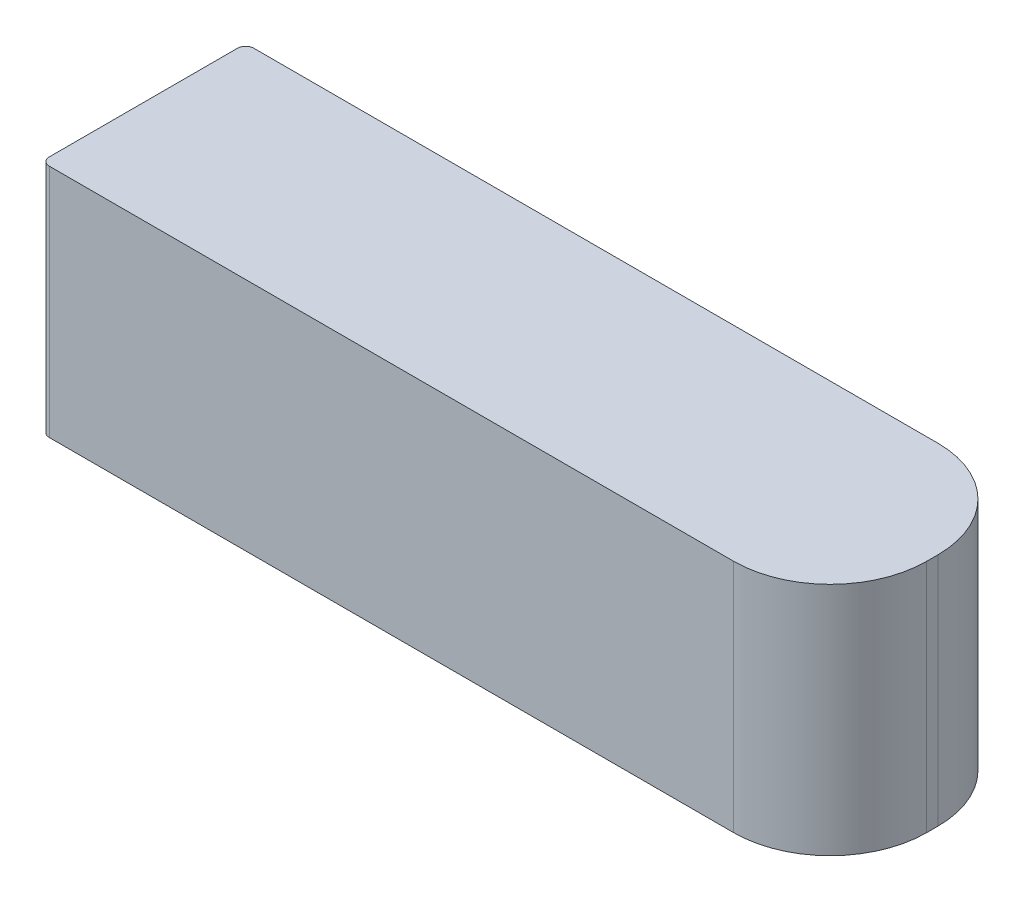
ISO-10303-21;
HEADER;
FILE_DESCRIPTION(('STEP AP214'),'2;1');
FILE_NAME('part.step','',(''),(''),'','','');
FILE_SCHEMA(('AUTOMOTIVE_DESIGN { 1 0 10303 214 1 1 1 1 }'));
ENDSEC;
DATA;
#1=APPLICATION_CONTEXT('core data for automotive mechanical design processes');
#2=APPLICATION_PROTOCOL_DEFINITION('international standard','automotive_design',2000,#1);
#3=PRODUCT_CONTEXT('',#1,'mechanical');
#4=PRODUCT('Part','Part','',(#3));
#5=PRODUCT_RELATED_PRODUCT_CATEGORY('part','',(#4));
#6=PRODUCT_DEFINITION_FORMATION('','',#4);
#7=PRODUCT_DEFINITION_CONTEXT('part definition',#1,'design');
#8=PRODUCT_DEFINITION('design','',#6,#7);
#9=PRODUCT_DEFINITION_SHAPE('','',#8);
#10=(LENGTH_UNIT() NAMED_UNIT(*) SI_UNIT(.MILLI.,.METRE.));
#11=(NAMED_UNIT(*) PLANE_ANGLE_UNIT() SI_UNIT($,.RADIAN.));
#12=(NAMED_UNIT(*) SI_UNIT($,.STERADIAN.) SOLID_ANGLE_UNIT());
#13=UNCERTAINTY_MEASURE_WITH_UNIT(LENGTH_MEASURE(1.E-05),#10,'distance_accuracy_value','');
#14=(GEOMETRIC_REPRESENTATION_CONTEXT(3) GLOBAL_UNCERTAINTY_ASSIGNED_CONTEXT((#13)) GLOBAL_UNIT_ASSIGNED_CONTEXT((#10,
#11,#12)) REPRESENTATION_CONTEXT('',''));
#15=CARTESIAN_POINT('',(0.,0.,0.));
#16=DIRECTION('',(0.,0.,1.));
#17=DIRECTION('',(1.,0.,0.));
#18=AXIS2_PLACEMENT_3D('',#15,#16,#17);
#19=CARTESIAN_POINT('',(49.022,29.21,12.7));
#20=DIRECTION('',(-1.,0.,0.));
#21=DIRECTION('',(0.,0.,1.));
#22=AXIS2_PLACEMENT_3D('',#19,#20,#21);
#23=PLANE('',#22);
#24=DIRECTION('',(0.,0.,-1.));
#25=VECTOR('',#24,1.);
#26=CARTESIAN_POINT('',(49.022,29.21,12.7));
#27=LINE('',#26,#25);
#28=CARTESIAN_POINT('',(49.022,29.21,0.699999999999999));
#29=VERTEX_POINT('',#28);
#30=CARTESIAN_POINT('',(49.022,29.21,-0.700000000000003));
#31=VERTEX_POINT('',#30);
#32=EDGE_CURVE('E118',#29,#31,#27,.T.);
#33=ORIENTED_EDGE('',*,*,#32,.F.);
#34=DIRECTION('',(0.,-1.,0.));
#35=VECTOR('',#34,1.);
#36=CARTESIAN_POINT('',(49.022,29.21,0.699999999999999));
#37=LINE('',#36,#35);
#38=CARTESIAN_POINT('',(49.022,0.,0.699999999999999));
#39=VERTEX_POINT('',#38);
#40=EDGE_CURVE('E104',#29,#39,#37,.T.);
#41=ORIENTED_EDGE('',*,*,#40,.T.);
#42=DIRECTION('',(0.,0.,-1.));
#43=VECTOR('',#42,1.);
#44=CARTESIAN_POINT('',(49.022,0.,12.7));
#45=LINE('',#44,#43);
#46=CARTESIAN_POINT('',(49.022,0.,-0.700000000000003));
#47=VERTEX_POINT('',#46);
#48=EDGE_CURVE('E115',#39,#47,#45,.T.);
#49=ORIENTED_EDGE('',*,*,#48,.T.);
#50=DIRECTION('',(0.,-1.,0.));
#51=VECTOR('',#50,1.);
#52=CARTESIAN_POINT('',(49.022,29.21,-0.700000000000003));
#53=LINE('',#52,#51);
#54=EDGE_CURVE('E119',#47,#31,#53,.F.);
#55=ORIENTED_EDGE('',*,*,#54,.T.);
#56=EDGE_LOOP('',(#33,#41,#49,#55));
#57=FACE_BOUND('',#56,.T.);
#58=ADVANCED_FACE('F32',(#57),#23,.F.);
#59=CARTESIAN_POINT('',(-49.022,29.21,-12.7));
#60=DIRECTION('',(0.,0.,1.));
#61=DIRECTION('',(1.,0.,0.));
#62=AXIS2_PLACEMENT_3D('',#59,#60,#61);
#63=PLANE('',#62);
#64=DIRECTION('',(-1.,0.,0.));
#65=VECTOR('',#64,1.);
#66=CARTESIAN_POINT('',(-49.022,0.,-12.7));
#67=LINE('',#66,#65);
#68=CARTESIAN_POINT('',(37.022,0.,-12.7));
#69=VERTEX_POINT('',#68);
#70=CARTESIAN_POINT('',(-48.022,0.,-12.7));
#71=VERTEX_POINT('',#70);
#72=EDGE_CURVE('E123',#69,#71,#67,.T.);
#73=ORIENTED_EDGE('',*,*,#72,.T.);
#74=DIRECTION('',(0.,-1.,0.));
#75=VECTOR('',#74,1.);
#76=CARTESIAN_POINT('',(-48.022,29.21,-12.7));
#77=LINE('',#76,#75);
#78=CARTESIAN_POINT('',(-48.022,29.21,-12.7));
#79=VERTEX_POINT('',#78);
#80=EDGE_CURVE('E11',#71,#79,#77,.F.);
#81=ORIENTED_EDGE('',*,*,#80,.T.);
#82=DIRECTION('',(-1.,0.,0.));
#83=VECTOR('',#82,1.);
#84=CARTESIAN_POINT('',(-49.022,29.21,-12.7));
#85=LINE('',#84,#83);
#86=CARTESIAN_POINT('',(37.022,29.21,-12.7));
#87=VERTEX_POINT('',#86);
#88=EDGE_CURVE('E173',#87,#79,#85,.T.);
#89=ORIENTED_EDGE('',*,*,#88,.F.);
#90=DIRECTION('',(0.,-1.,0.));
#91=VECTOR('',#90,1.);
#92=CARTESIAN_POINT('',(37.022,29.21,-12.7));
#93=LINE('',#92,#91);
#94=EDGE_CURVE('E141',#87,#69,#93,.T.);
#95=ORIENTED_EDGE('',*,*,#94,.T.);
#96=EDGE_LOOP('',(#73,#81,#89,#95));
#97=FACE_BOUND('',#96,.T.);
#98=ADVANCED_FACE('F171',(#97),#63,.F.);
#99=CARTESIAN_POINT('',(-49.022,29.21,12.7));
#100=DIRECTION('',(1.,0.,0.));
#101=DIRECTION('',(0.,0.,-1.));
#102=AXIS2_PLACEMENT_3D('',#99,#100,#101);
#103=PLANE('',#102);
#104=DIRECTION('',(0.,0.,1.));
#105=VECTOR('',#104,1.);
#106=CARTESIAN_POINT('',(-49.022,0.,12.7));
#107=LINE('',#106,#105);
#108=CARTESIAN_POINT('',(-49.022,0.,-11.7));
#109=VERTEX_POINT('',#108);
#110=CARTESIAN_POINT('',(-49.022,0.,11.7));
#111=VERTEX_POINT('',#110);
#112=EDGE_CURVE('E125',#109,#111,#107,.T.);
#113=ORIENTED_EDGE('',*,*,#112,.T.);
#114=DIRECTION('',(0.,-1.,0.));
#115=VECTOR('',#114,1.);
#116=CARTESIAN_POINT('',(-49.022,29.21,11.7));
#117=LINE('',#116,#115);
#118=CARTESIAN_POINT('',(-49.022,29.21,11.7));
#119=VERTEX_POINT('',#118);
#120=EDGE_CURVE('E53',#111,#119,#117,.F.);
#121=ORIENTED_EDGE('',*,*,#120,.T.);
#122=DIRECTION('',(0.,0.,1.));
#123=VECTOR('',#122,1.);
#124=CARTESIAN_POINT('',(-49.022,29.21,12.7));
#125=LINE('',#124,#123);
#126=CARTESIAN_POINT('',(-49.022,29.21,-11.7));
#127=VERTEX_POINT('',#126);
#128=EDGE_CURVE('E160',#127,#119,#125,.T.);
#129=ORIENTED_EDGE('',*,*,#128,.F.);
#130=DIRECTION('',(0.,-1.,0.));
#131=VECTOR('',#130,1.);
#132=CARTESIAN_POINT('',(-49.022,29.21,-11.7));
#133=LINE('',#132,#131);
#134=EDGE_CURVE('E151',#127,#109,#133,.T.);
#135=ORIENTED_EDGE('',*,*,#134,.T.);
#136=EDGE_LOOP('',(#113,#121,#129,#135));
#137=FACE_BOUND('',#136,.T.);
#138=ADVANCED_FACE('F167',(#137),#103,.F.);
#139=CARTESIAN_POINT('',(-49.022,29.21,12.7));
#140=DIRECTION('',(0.,0.,-1.));
#141=DIRECTION('',(-1.,0.,0.));
#142=AXIS2_PLACEMENT_3D('',#139,#140,#141);
#143=PLANE('',#142);
#144=DIRECTION('',(1.,0.,0.));
#145=VECTOR('',#144,1.);
#146=CARTESIAN_POINT('',(-49.022,29.21,12.7));
#147=LINE('',#146,#145);
#148=CARTESIAN_POINT('',(-48.022,29.21,12.7));
#149=VERTEX_POINT('',#148);
#150=CARTESIAN_POINT('',(37.022,29.21,12.7));
#151=VERTEX_POINT('',#150);
#152=EDGE_CURVE('E128',#149,#151,#147,.T.);
#153=ORIENTED_EDGE('',*,*,#152,.F.);
#154=DIRECTION('',(0.,-1.,0.));
#155=VECTOR('',#154,1.);
#156=CARTESIAN_POINT('',(-48.022,29.21,12.7));
#157=LINE('',#156,#155);
#158=CARTESIAN_POINT('',(-48.022,0.,12.7));
#159=VERTEX_POINT('',#158);
#160=EDGE_CURVE('E144',#149,#159,#157,.T.);
#161=ORIENTED_EDGE('',*,*,#160,.T.);
#162=DIRECTION('',(1.,0.,0.));
#163=VECTOR('',#162,1.);
#164=CARTESIAN_POINT('',(-49.022,0.,12.7));
#165=LINE('',#164,#163);
#166=CARTESIAN_POINT('',(37.022,0.,12.7));
#167=VERTEX_POINT('',#166);
#168=EDGE_CURVE('E132',#159,#167,#165,.T.);
#169=ORIENTED_EDGE('',*,*,#168,.T.);
#170=DIRECTION('',(0.,-1.,0.));
#171=VECTOR('',#170,1.);
#172=CARTESIAN_POINT('',(37.022,29.21,12.7));
#173=LINE('',#172,#171);
#174=EDGE_CURVE('E106',#167,#151,#173,.F.);
#175=ORIENTED_EDGE('',*,*,#174,.T.);
#176=EDGE_LOOP('',(#153,#161,#169,#175));
#177=FACE_BOUND('',#176,.T.);
#178=ADVANCED_FACE('F164',(#177),#143,.F.);
#179=CARTESIAN_POINT('',(0.,29.21,0.));
#180=DIRECTION('',(0.,-1.,0.));
#181=DIRECTION('',(0.,0.,-1.));
#182=AXIS2_PLACEMENT_3D('',#179,#180,#181);
#183=PLANE('',#182);
#184=ORIENTED_EDGE('',*,*,#128,.T.);
#185=CARTESIAN_POINT('',(-48.022,29.21,11.7));
#186=DIRECTION('',(0.,-1.,0.));
#187=DIRECTION('',(0.,0.,-1.));
#188=AXIS2_PLACEMENT_3D('',#185,#186,#187);
#189=CIRCLE('',#188,1.);
#190=EDGE_CURVE('E40',#119,#149,#189,.F.);
#191=ORIENTED_EDGE('',*,*,#190,.T.);
#192=ORIENTED_EDGE('',*,*,#152,.T.);
#193=CARTESIAN_POINT('',(37.022,29.21,0.699999999999999));
#194=DIRECTION('',(0.,-1.,0.));
#195=DIRECTION('',(0.,0.,-1.));
#196=AXIS2_PLACEMENT_3D('',#193,#194,#195);
#197=CIRCLE('',#196,12.);
#198=EDGE_CURVE('E139',#151,#29,#197,.F.);
#199=ORIENTED_EDGE('',*,*,#198,.T.);
#200=ORIENTED_EDGE('',*,*,#32,.T.);
#201=CARTESIAN_POINT('',(37.022,29.21,-0.700000000000003));
#202=DIRECTION('',(0.,-1.,0.));
#203=DIRECTION('',(0.,0.,-1.));
#204=AXIS2_PLACEMENT_3D('',#201,#202,#203);
#205=CIRCLE('',#204,12.);
#206=EDGE_CURVE('E137',#31,#87,#205,.F.);
#207=ORIENTED_EDGE('',*,*,#206,.T.);
#208=ORIENTED_EDGE('',*,*,#88,.T.);
#209=CARTESIAN_POINT('',(-48.022,29.21,-11.7));
#210=DIRECTION('',(0.,-1.,0.));
#211=DIRECTION('',(0.,0.,-1.));
#212=AXIS2_PLACEMENT_3D('',#209,#210,#211);
#213=CIRCLE('',#212,1.);
#214=EDGE_CURVE('E155',#79,#127,#213,.F.);
#215=ORIENTED_EDGE('',*,*,#214,.T.);
#216=EDGE_LOOP('',(#184,#191,#192,#199,#200,#207,#208,#215));
#217=FACE_BOUND('',#216,.T.);
#218=ADVANCED_FACE('F159',(#217),#183,.F.);
#219=CARTESIAN_POINT('',(0.,0.,0.));
#220=DIRECTION('',(0.,-1.,0.));
#221=DIRECTION('',(0.,0.,-1.));
#222=AXIS2_PLACEMENT_3D('',#219,#220,#221);
#223=PLANE('',#222);
#224=ORIENTED_EDGE('',*,*,#168,.F.);
#225=CARTESIAN_POINT('',(-48.022,0.,11.7));
#226=DIRECTION('',(0.,-1.,0.));
#227=DIRECTION('',(0.,0.,-1.));
#228=AXIS2_PLACEMENT_3D('',#225,#226,#227);
#229=CIRCLE('',#228,1.);
#230=EDGE_CURVE('E149',#159,#111,#229,.T.);
#231=ORIENTED_EDGE('',*,*,#230,.T.);
#232=ORIENTED_EDGE('',*,*,#112,.F.);
#233=CARTESIAN_POINT('',(-48.022,0.,-11.7));
#234=DIRECTION('',(0.,-1.,0.));
#235=DIRECTION('',(0.,0.,-1.));
#236=AXIS2_PLACEMENT_3D('',#233,#234,#235);
#237=CIRCLE('',#236,1.);
#238=EDGE_CURVE('E147',#109,#71,#237,.T.);
#239=ORIENTED_EDGE('',*,*,#238,.T.);
#240=ORIENTED_EDGE('',*,*,#72,.F.);
#241=CARTESIAN_POINT('',(37.022,0.,-0.700000000000003));
#242=DIRECTION('',(0.,-1.,0.));
#243=DIRECTION('',(0.,0.,-1.));
#244=AXIS2_PLACEMENT_3D('',#241,#242,#243);
#245=CIRCLE('',#244,12.);
#246=EDGE_CURVE('E110',#69,#47,#245,.T.);
#247=ORIENTED_EDGE('',*,*,#246,.T.);
#248=ORIENTED_EDGE('',*,*,#48,.F.);
#249=CARTESIAN_POINT('',(37.022,0.,0.699999999999999));
#250=DIRECTION('',(0.,-1.,0.));
#251=DIRECTION('',(0.,0.,-1.));
#252=AXIS2_PLACEMENT_3D('',#249,#250,#251);
#253=CIRCLE('',#252,12.);
#254=EDGE_CURVE('E100',#39,#167,#253,.T.);
#255=ORIENTED_EDGE('',*,*,#254,.T.);
#256=EDGE_LOOP('',(#224,#231,#232,#239,#240,#247,#248,#255));
#257=FACE_BOUND('',#256,.T.);
#258=ADVANCED_FACE('F121',(#257),#223,.T.);
#259=CARTESIAN_POINT('',(37.022,29.21,0.699999999999999));
#260=DIRECTION('',(0.,-1.,0.));
#261=DIRECTION('',(0.,0.,-1.));
#262=AXIS2_PLACEMENT_3D('',#259,#260,#261);
#263=CYLINDRICAL_SURFACE('',#262,12.);
#264=ORIENTED_EDGE('',*,*,#198,.F.);
#265=ORIENTED_EDGE('',*,*,#174,.F.);
#266=ORIENTED_EDGE('',*,*,#254,.F.);
#267=ORIENTED_EDGE('',*,*,#40,.F.);
#268=EDGE_LOOP('',(#264,#265,#266,#267));
#269=FACE_BOUND('',#268,.T.);
#270=ADVANCED_FACE('F103',(#269),#263,.T.);
#271=CARTESIAN_POINT('',(37.022,29.21,-0.700000000000003));
#272=DIRECTION('',(0.,-1.,0.));
#273=DIRECTION('',(0.,0.,-1.));
#274=AXIS2_PLACEMENT_3D('',#271,#272,#273);
#275=CYLINDRICAL_SURFACE('',#274,12.);
#276=ORIENTED_EDGE('',*,*,#206,.F.);
#277=ORIENTED_EDGE('',*,*,#54,.F.);
#278=ORIENTED_EDGE('',*,*,#246,.F.);
#279=ORIENTED_EDGE('',*,*,#94,.F.);
#280=EDGE_LOOP('',(#276,#277,#278,#279));
#281=FACE_BOUND('',#280,.T.);
#282=ADVANCED_FACE('F176',(#281),#275,.T.);
#283=CARTESIAN_POINT('',(-48.022,29.21,11.7));
#284=DIRECTION('',(0.,-1.,0.));
#285=DIRECTION('',(0.,0.,-1.));
#286=AXIS2_PLACEMENT_3D('',#283,#284,#285);
#287=CYLINDRICAL_SURFACE('',#286,1.);
#288=ORIENTED_EDGE('',*,*,#190,.F.);
#289=ORIENTED_EDGE('',*,*,#120,.F.);
#290=ORIENTED_EDGE('',*,*,#230,.F.);
#291=ORIENTED_EDGE('',*,*,#160,.F.);
#292=EDGE_LOOP('',(#288,#289,#290,#291));
#293=FACE_BOUND('',#292,.T.);
#294=ADVANCED_FACE('F165',(#293),#287,.T.);
#295=CARTESIAN_POINT('',(-48.022,29.21,-11.7));
#296=DIRECTION('',(0.,-1.,0.));
#297=DIRECTION('',(0.,0.,-1.));
#298=AXIS2_PLACEMENT_3D('',#295,#296,#297);
#299=CYLINDRICAL_SURFACE('',#298,1.);
#300=ORIENTED_EDGE('',*,*,#214,.F.);
#301=ORIENTED_EDGE('',*,*,#80,.F.);
#302=ORIENTED_EDGE('',*,*,#238,.F.);
#303=ORIENTED_EDGE('',*,*,#134,.F.);
#304=EDGE_LOOP('',(#300,#301,#302,#303));
#305=FACE_BOUND('',#304,.T.);
#306=ADVANCED_FACE('F34',(#305),#299,.T.);
#307=CLOSED_SHELL('',(#58,#98,#138,#178,#218,#258,#270,#282,#294,#306));
#308=MANIFOLD_SOLID_BREP('B2',#307);
#309=ADVANCED_BREP_SHAPE_REPRESENTATION('',(#18,#308),#14);
#310=SHAPE_DEFINITION_REPRESENTATION(#9,#309);
ENDSEC;
END-ISO-10303-21;
